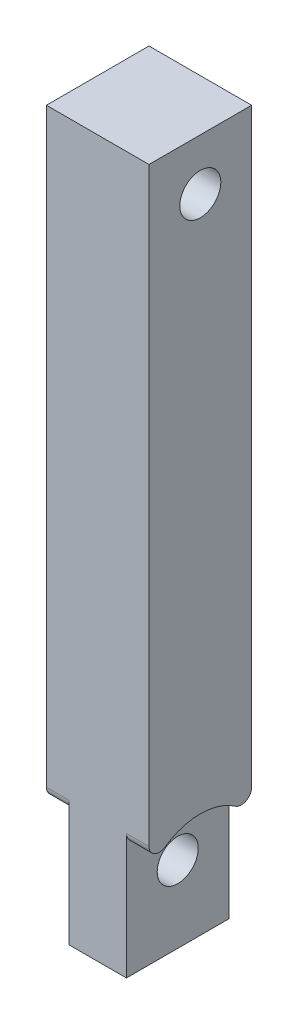
ISO-10303-21;
HEADER;
FILE_DESCRIPTION(('STEP AP214'),'2;1');
FILE_NAME('part.step','',(''),(''),'','','');
FILE_SCHEMA(('AUTOMOTIVE_DESIGN { 1 0 10303 214 1 1 1 1 }'));
ENDSEC;
DATA;
#1=APPLICATION_CONTEXT('core data for automotive mechanical design processes');
#2=APPLICATION_PROTOCOL_DEFINITION('international standard','automotive_design',2000,#1);
#3=PRODUCT_CONTEXT('',#1,'mechanical');
#4=PRODUCT('Part','Part','',(#3));
#5=PRODUCT_RELATED_PRODUCT_CATEGORY('part','',(#4));
#6=PRODUCT_DEFINITION_FORMATION('','',#4);
#7=PRODUCT_DEFINITION_CONTEXT('part definition',#1,'design');
#8=PRODUCT_DEFINITION('design','',#6,#7);
#9=PRODUCT_DEFINITION_SHAPE('','',#8);
#10=(LENGTH_UNIT() NAMED_UNIT(*) SI_UNIT(.MILLI.,.METRE.));
#11=(NAMED_UNIT(*) PLANE_ANGLE_UNIT() SI_UNIT($,.RADIAN.));
#12=(NAMED_UNIT(*) SI_UNIT($,.STERADIAN.) SOLID_ANGLE_UNIT());
#13=UNCERTAINTY_MEASURE_WITH_UNIT(LENGTH_MEASURE(1.E-05),#10,'distance_accuracy_value','');
#14=(GEOMETRIC_REPRESENTATION_CONTEXT(3) GLOBAL_UNCERTAINTY_ASSIGNED_CONTEXT((#13)) GLOBAL_UNIT_ASSIGNED_CONTEXT((#10,
#11,#12)) REPRESENTATION_CONTEXT('',''));
#15=CARTESIAN_POINT('',(0.,0.,0.));
#16=DIRECTION('',(0.,0.,1.));
#17=DIRECTION('',(1.,0.,0.));
#18=AXIS2_PLACEMENT_3D('',#15,#16,#17);
#19=CARTESIAN_POINT('',(0.,300.,0.));
#20=DIRECTION('',(-1.,0.,0.));
#21=DIRECTION('',(0.,0.,1.));
#22=AXIS2_PLACEMENT_3D('',#19,#20,#21);
#23=PLANE('',#22);
#24=CARTESIAN_POINT('',(0.,275.,-25.));
#25=DIRECTION('',(1.,0.,0.));
#26=DIRECTION('',(0.,0.,-1.));
#27=AXIS2_PLACEMENT_3D('',#24,#25,#26);
#28=CIRCLE('',#27,10.);
#29=CARTESIAN_POINT('',(0.,275.,-35.));
#30=VERTEX_POINT('',#29);
#31=EDGE_CURVE('E246',#30,#30,#28,.T.);
#32=ORIENTED_EDGE('',*,*,#31,.F.);
#33=EDGE_LOOP('',(#32));
#34=FACE_BOUND('',#33,.T.);
#35=CARTESIAN_POINT('',(0.,-16.583123951777,-25.));
#36=DIRECTION('',(1.,0.,0.));
#37=DIRECTION('',(0.,0.,-1.));
#38=AXIS2_PLACEMENT_3D('',#35,#36,#37);
#39=CIRCLE('',#38,30.);
#40=CARTESIAN_POINT('',(0.,8.03643024767171,-42.1428571428571));
#41=VERTEX_POINT('',#40);
#42=CARTESIAN_POINT('',(0.,8.0364302476717,-7.85714285714286));
#43=VERTEX_POINT('',#42);
#44=EDGE_CURVE('E143',#41,#43,#39,.T.);
#45=ORIENTED_EDGE('',*,*,#44,.F.);
#46=CARTESIAN_POINT('',(0.,12.1396892809132,-45.));
#47=DIRECTION('',(-1.,0.,0.));
#48=DIRECTION('',(0.,0.,1.));
#49=AXIS2_PLACEMENT_3D('',#46,#47,#48);
#50=CIRCLE('',#49,5.);
#51=CARTESIAN_POINT('',(0.,12.1396892809132,-50.));
#52=VERTEX_POINT('',#51);
#53=EDGE_CURVE('E205',#41,#52,#50,.F.);
#54=ORIENTED_EDGE('',*,*,#53,.T.);
#55=DIRECTION('',(0.,-1.,0.));
#56=VECTOR('',#55,1.);
#57=CARTESIAN_POINT('',(0.,300.,-50.));
#58=LINE('',#57,#56);
#59=CARTESIAN_POINT('',(0.,300.,-50.));
#60=VERTEX_POINT('',#59);
#61=EDGE_CURVE('E170',#60,#52,#58,.T.);
#62=ORIENTED_EDGE('',*,*,#61,.F.);
#63=DIRECTION('',(0.,0.,-1.));
#64=VECTOR('',#63,1.);
#65=CARTESIAN_POINT('',(0.,300.,0.));
#66=LINE('',#65,#64);
#67=CARTESIAN_POINT('',(0.,300.,0.));
#68=VERTEX_POINT('',#67);
#69=EDGE_CURVE('E150',#68,#60,#66,.T.);
#70=ORIENTED_EDGE('',*,*,#69,.F.);
#71=DIRECTION('',(0.,-1.,0.));
#72=VECTOR('',#71,1.);
#73=CARTESIAN_POINT('',(0.,300.,0.));
#74=LINE('',#73,#72);
#75=CARTESIAN_POINT('',(0.,12.1396892809131,0.));
#76=VERTEX_POINT('',#75);
#77=EDGE_CURVE('E163',#68,#76,#74,.T.);
#78=ORIENTED_EDGE('',*,*,#77,.T.);
#79=CARTESIAN_POINT('',(0.,12.1396892809131,-5.));
#80=DIRECTION('',(-1.,0.,0.));
#81=DIRECTION('',(0.,0.,1.));
#82=AXIS2_PLACEMENT_3D('',#79,#80,#81);
#83=CIRCLE('',#82,5.);
#84=EDGE_CURVE('E56',#76,#43,#83,.F.);
#85=ORIENTED_EDGE('',*,*,#84,.T.);
#86=EDGE_LOOP('',(#45,#54,#62,#70,#78,#85));
#87=FACE_BOUND('',#86,.T.);
#88=ADVANCED_FACE('F34',(#34,#87),#23,.F.);
#89=CARTESIAN_POINT('',(0.,300.,-50.));
#90=DIRECTION('',(0.,0.,1.));
#91=DIRECTION('',(1.,0.,0.));
#92=AXIS2_PLACEMENT_3D('',#89,#90,#91);
#93=PLANE('',#92);
#94=ORIENTED_EDGE('',*,*,#61,.T.);
#95=DIRECTION('',(1.,0.,0.));
#96=VECTOR('',#95,1.);
#97=CARTESIAN_POINT('',(0.,12.1396892809132,-50.));
#98=LINE('',#97,#96);
#99=CARTESIAN_POINT('',(-11.,12.1396892809132,-50.));
#100=VERTEX_POINT('',#99);
#101=EDGE_CURVE('E198',#52,#100,#98,.F.);
#102=ORIENTED_EDGE('',*,*,#101,.T.);
#103=DIRECTION('',(0.,1.,0.));
#104=VECTOR('',#103,1.);
#105=CARTESIAN_POINT('',(-11.,-48.9,-50.));
#106=LINE('',#105,#104);
#107=CARTESIAN_POINT('',(-11.,-48.9,-50.));
#108=VERTEX_POINT('',#107);
#109=EDGE_CURVE('E132',#108,#100,#106,.T.);
#110=ORIENTED_EDGE('',*,*,#109,.F.);
#111=DIRECTION('',(1.,0.,0.));
#112=VECTOR('',#111,1.);
#113=CARTESIAN_POINT('',(-39.,-48.9,-50.));
#114=LINE('',#113,#112);
#115=CARTESIAN_POINT('',(-39.,-48.9,-50.));
#116=VERTEX_POINT('',#115);
#117=EDGE_CURVE('E123',#116,#108,#114,.T.);
#118=ORIENTED_EDGE('',*,*,#117,.F.);
#119=DIRECTION('',(0.,1.,0.));
#120=VECTOR('',#119,1.);
#121=CARTESIAN_POINT('',(-39.,-48.9,-50.));
#122=LINE('',#121,#120);
#123=CARTESIAN_POINT('',(-39.,12.1396892809131,-50.));
#124=VERTEX_POINT('',#123);
#125=EDGE_CURVE('E129',#116,#124,#122,.T.);
#126=ORIENTED_EDGE('',*,*,#125,.T.);
#127=DIRECTION('',(1.,0.,0.));
#128=VECTOR('',#127,1.);
#129=CARTESIAN_POINT('',(-50.,12.1396892809131,-50.));
#130=LINE('',#129,#128);
#131=CARTESIAN_POINT('',(-50.,12.1396892809131,-50.));
#132=VERTEX_POINT('',#131);
#133=EDGE_CURVE('E193',#124,#132,#130,.F.);
#134=ORIENTED_EDGE('',*,*,#133,.T.);
#135=DIRECTION('',(0.,-1.,0.));
#136=VECTOR('',#135,1.);
#137=CARTESIAN_POINT('',(-50.,300.,-50.));
#138=LINE('',#137,#136);
#139=CARTESIAN_POINT('',(-50.,300.,-50.));
#140=VERTEX_POINT('',#139);
#141=EDGE_CURVE('E167',#140,#132,#138,.T.);
#142=ORIENTED_EDGE('',*,*,#141,.F.);
#143=DIRECTION('',(-1.,0.,0.));
#144=VECTOR('',#143,1.);
#145=CARTESIAN_POINT('',(0.,300.,-50.));
#146=LINE('',#145,#144);
#147=EDGE_CURVE('E153',#60,#140,#146,.T.);
#148=ORIENTED_EDGE('',*,*,#147,.F.);
#149=EDGE_LOOP('',(#94,#102,#110,#118,#126,#134,#142,#148));
#150=FACE_BOUND('',#149,.T.);
#151=ADVANCED_FACE('F126',(#150),#93,.F.);
#152=CARTESIAN_POINT('',(-50.,300.,0.));
#153=DIRECTION('',(1.,0.,0.));
#154=DIRECTION('',(0.,0.,-1.));
#155=AXIS2_PLACEMENT_3D('',#152,#153,#154);
#156=PLANE('',#155);
#157=CARTESIAN_POINT('',(-50.,275.,-25.));
#158=DIRECTION('',(1.,0.,0.));
#159=DIRECTION('',(0.,0.,-1.));
#160=AXIS2_PLACEMENT_3D('',#157,#158,#159);
#161=CIRCLE('',#160,10.);
#162=CARTESIAN_POINT('',(-50.,275.,-35.));
#163=VERTEX_POINT('',#162);
#164=EDGE_CURVE('E245',#163,#163,#161,.T.);
#165=ORIENTED_EDGE('',*,*,#164,.T.);
#166=EDGE_LOOP('',(#165));
#167=FACE_BOUND('',#166,.T.);
#168=CARTESIAN_POINT('',(-50.,-16.583123951777,-25.));
#169=DIRECTION('',(1.,0.,0.));
#170=DIRECTION('',(0.,0.,-1.));
#171=AXIS2_PLACEMENT_3D('',#168,#169,#170);
#172=CIRCLE('',#171,30.);
#173=CARTESIAN_POINT('',(-50.,8.03643024767169,-42.1428571428572));
#174=VERTEX_POINT('',#173);
#175=CARTESIAN_POINT('',(-50.,8.0364302476717,-7.85714285714286));
#176=VERTEX_POINT('',#175);
#177=EDGE_CURVE('E181',#174,#176,#172,.T.);
#178=ORIENTED_EDGE('',*,*,#177,.T.);
#179=CARTESIAN_POINT('',(-50.,12.1396892809131,-5.));
#180=DIRECTION('',(1.,0.,0.));
#181=DIRECTION('',(0.,0.,-1.));
#182=AXIS2_PLACEMENT_3D('',#179,#180,#181);
#183=CIRCLE('',#182,5.);
#184=CARTESIAN_POINT('',(-50.,12.1396892809131,0.));
#185=VERTEX_POINT('',#184);
#186=EDGE_CURVE('E191',#176,#185,#183,.F.);
#187=ORIENTED_EDGE('',*,*,#186,.T.);
#188=DIRECTION('',(0.,-1.,0.));
#189=VECTOR('',#188,1.);
#190=CARTESIAN_POINT('',(-50.,300.,0.));
#191=LINE('',#190,#189);
#192=CARTESIAN_POINT('',(-50.,300.,0.));
#193=VERTEX_POINT('',#192);
#194=EDGE_CURVE('E164',#193,#185,#191,.T.);
#195=ORIENTED_EDGE('',*,*,#194,.F.);
#196=DIRECTION('',(0.,0.,1.));
#197=VECTOR('',#196,1.);
#198=CARTESIAN_POINT('',(-50.,300.,0.));
#199=LINE('',#198,#197);
#200=EDGE_CURVE('E159',#140,#193,#199,.T.);
#201=ORIENTED_EDGE('',*,*,#200,.F.);
#202=ORIENTED_EDGE('',*,*,#141,.T.);
#203=CARTESIAN_POINT('',(-50.,12.1396892809131,-45.));
#204=DIRECTION('',(1.,0.,0.));
#205=DIRECTION('',(0.,0.,-1.));
#206=AXIS2_PLACEMENT_3D('',#203,#204,#205);
#207=CIRCLE('',#206,5.);
#208=EDGE_CURVE('E189',#132,#174,#207,.F.);
#209=ORIENTED_EDGE('',*,*,#208,.T.);
#210=EDGE_LOOP('',(#178,#187,#195,#201,#202,#209));
#211=FACE_BOUND('',#210,.T.);
#212=ADVANCED_FACE('F252',(#167,#211),#156,.F.);
#213=CARTESIAN_POINT('',(0.,300.,0.));
#214=DIRECTION('',(0.,0.,-1.));
#215=DIRECTION('',(-1.,0.,0.));
#216=AXIS2_PLACEMENT_3D('',#213,#214,#215);
#217=PLANE('',#216);
#218=DIRECTION('',(0.,1.,0.));
#219=VECTOR('',#218,1.);
#220=CARTESIAN_POINT('',(-11.,-48.9,0.));
#221=LINE('',#220,#219);
#222=CARTESIAN_POINT('',(-11.,-48.9,0.));
#223=VERTEX_POINT('',#222);
#224=CARTESIAN_POINT('',(-11.,12.1396892809131,0.));
#225=VERTEX_POINT('',#224);
#226=EDGE_CURVE('E49',#223,#225,#221,.T.);
#227=ORIENTED_EDGE('',*,*,#226,.T.);
#228=DIRECTION('',(1.,0.,0.));
#229=VECTOR('',#228,1.);
#230=CARTESIAN_POINT('',(0.,12.1396892809131,0.));
#231=LINE('',#230,#229);
#232=EDGE_CURVE('E207',#225,#76,#231,.T.);
#233=ORIENTED_EDGE('',*,*,#232,.T.);
#234=ORIENTED_EDGE('',*,*,#77,.F.);
#235=DIRECTION('',(1.,0.,0.));
#236=VECTOR('',#235,1.);
#237=CARTESIAN_POINT('',(0.,300.,0.));
#238=LINE('',#237,#236);
#239=EDGE_CURVE('E161',#193,#68,#238,.T.);
#240=ORIENTED_EDGE('',*,*,#239,.F.);
#241=ORIENTED_EDGE('',*,*,#194,.T.);
#242=DIRECTION('',(1.,0.,0.));
#243=VECTOR('',#242,1.);
#244=CARTESIAN_POINT('',(-39.,12.1396892809131,0.));
#245=LINE('',#244,#243);
#246=CARTESIAN_POINT('',(-39.,12.1396892809131,0.));
#247=VERTEX_POINT('',#246);
#248=EDGE_CURVE('E174',#185,#247,#245,.T.);
#249=ORIENTED_EDGE('',*,*,#248,.T.);
#250=DIRECTION('',(0.,1.,0.));
#251=VECTOR('',#250,1.);
#252=CARTESIAN_POINT('',(-39.,-48.9,0.));
#253=LINE('',#252,#251);
#254=CARTESIAN_POINT('',(-39.,-48.9,0.));
#255=VERTEX_POINT('',#254);
#256=EDGE_CURVE('E234',#255,#247,#253,.T.);
#257=ORIENTED_EDGE('',*,*,#256,.F.);
#258=DIRECTION('',(-1.,0.,0.));
#259=VECTOR('',#258,1.);
#260=CARTESIAN_POINT('',(-39.,-48.9,0.));
#261=LINE('',#260,#259);
#262=EDGE_CURVE('E140',#223,#255,#261,.T.);
#263=ORIENTED_EDGE('',*,*,#262,.F.);
#264=EDGE_LOOP('',(#227,#233,#234,#240,#241,#249,#257,#263));
#265=FACE_BOUND('',#264,.T.);
#266=ADVANCED_FACE('F233',(#265),#217,.F.);
#267=CARTESIAN_POINT('',(0.,300.,0.));
#268=DIRECTION('',(0.,1.,0.));
#269=DIRECTION('',(0.,0.,1.));
#270=AXIS2_PLACEMENT_3D('',#267,#268,#269);
#271=PLANE('',#270);
#272=ORIENTED_EDGE('',*,*,#69,.T.);
#273=ORIENTED_EDGE('',*,*,#147,.T.);
#274=ORIENTED_EDGE('',*,*,#200,.T.);
#275=ORIENTED_EDGE('',*,*,#239,.T.);
#276=EDGE_LOOP('',(#272,#273,#274,#275));
#277=FACE_BOUND('',#276,.T.);
#278=ADVANCED_FACE('F230',(#277),#271,.T.);
#279=CARTESIAN_POINT('',(-39.,-48.9,0.));
#280=DIRECTION('',(1.,0.,0.));
#281=DIRECTION('',(0.,0.,-1.));
#282=AXIS2_PLACEMENT_3D('',#279,#280,#281);
#283=PLANE('',#282);
#284=CARTESIAN_POINT('',(-39.,-11.583123951777,-25.));
#285=DIRECTION('',(-1.,0.,0.));
#286=DIRECTION('',(0.,0.,1.));
#287=AXIS2_PLACEMENT_3D('',#284,#285,#286);
#288=CIRCLE('',#287,10.);
#289=CARTESIAN_POINT('',(-39.,-11.583123951777,-15.));
#290=VERTEX_POINT('',#289);
#291=EDGE_CURVE('E182',#290,#290,#288,.T.);
#292=ORIENTED_EDGE('',*,*,#291,.F.);
#293=EDGE_LOOP('',(#292));
#294=FACE_BOUND('',#293,.T.);
#295=ORIENTED_EDGE('',*,*,#256,.T.);
#296=CARTESIAN_POINT('',(-39.,12.1396892809131,-5.));
#297=DIRECTION('',(1.,0.,0.));
#298=DIRECTION('',(0.,0.,-1.));
#299=AXIS2_PLACEMENT_3D('',#296,#297,#298);
#300=CIRCLE('',#299,5.);
#301=CARTESIAN_POINT('',(-39.,8.0364302476717,-7.85714285714286));
#302=VERTEX_POINT('',#301);
#303=EDGE_CURVE('E195',#247,#302,#300,.T.);
#304=ORIENTED_EDGE('',*,*,#303,.T.);
#305=CARTESIAN_POINT('',(-39.,-16.583123951777,-25.));
#306=DIRECTION('',(1.,0.,0.));
#307=DIRECTION('',(0.,0.,-1.));
#308=AXIS2_PLACEMENT_3D('',#305,#306,#307);
#309=CIRCLE('',#308,30.);
#310=CARTESIAN_POINT('',(-39.,8.03643024767169,-42.1428571428572));
#311=VERTEX_POINT('',#310);
#312=EDGE_CURVE('E220',#311,#302,#309,.T.);
#313=ORIENTED_EDGE('',*,*,#312,.F.);
#314=CARTESIAN_POINT('',(-39.,12.1396892809131,-45.));
#315=DIRECTION('',(1.,0.,0.));
#316=DIRECTION('',(0.,0.,-1.));
#317=AXIS2_PLACEMENT_3D('',#314,#315,#316);
#318=CIRCLE('',#317,5.);
#319=EDGE_CURVE('E148',#311,#124,#318,.T.);
#320=ORIENTED_EDGE('',*,*,#319,.T.);
#321=ORIENTED_EDGE('',*,*,#125,.F.);
#322=DIRECTION('',(0.,0.,-1.));
#323=VECTOR('',#322,1.);
#324=CARTESIAN_POINT('',(-39.,-48.9,0.));
#325=LINE('',#324,#323);
#326=EDGE_CURVE('E136',#255,#116,#325,.T.);
#327=ORIENTED_EDGE('',*,*,#326,.F.);
#328=EDGE_LOOP('',(#295,#304,#313,#320,#321,#327));
#329=FACE_BOUND('',#328,.T.);
#330=ADVANCED_FACE('F145',(#294,#329),#283,.F.);
#331=CARTESIAN_POINT('',(-11.,-48.9,0.));
#332=DIRECTION('',(-1.,0.,0.));
#333=DIRECTION('',(0.,0.,1.));
#334=AXIS2_PLACEMENT_3D('',#331,#332,#333);
#335=PLANE('',#334);
#336=CARTESIAN_POINT('',(-11.,-11.583123951777,-25.));
#337=DIRECTION('',(-1.,0.,0.));
#338=DIRECTION('',(0.,0.,1.));
#339=AXIS2_PLACEMENT_3D('',#336,#337,#338);
#340=CIRCLE('',#339,10.);
#341=CARTESIAN_POINT('',(-11.,-11.583123951777,-15.));
#342=VERTEX_POINT('',#341);
#343=EDGE_CURVE('E178',#342,#342,#340,.T.);
#344=ORIENTED_EDGE('',*,*,#343,.T.);
#345=EDGE_LOOP('',(#344));
#346=FACE_BOUND('',#345,.T.);
#347=ORIENTED_EDGE('',*,*,#109,.T.);
#348=CARTESIAN_POINT('',(-11.,12.1396892809132,-45.));
#349=DIRECTION('',(-1.,0.,0.));
#350=DIRECTION('',(0.,0.,1.));
#351=AXIS2_PLACEMENT_3D('',#348,#349,#350);
#352=CIRCLE('',#351,5.);
#353=CARTESIAN_POINT('',(-11.,8.03643024767171,-42.1428571428571));
#354=VERTEX_POINT('',#353);
#355=EDGE_CURVE('E42',#100,#354,#352,.T.);
#356=ORIENTED_EDGE('',*,*,#355,.T.);
#357=CARTESIAN_POINT('',(-11.,-16.583123951777,-25.));
#358=DIRECTION('',(-1.,0.,0.));
#359=DIRECTION('',(0.,0.,1.));
#360=AXIS2_PLACEMENT_3D('',#357,#358,#359);
#361=CIRCLE('',#360,30.);
#362=CARTESIAN_POINT('',(-11.,8.0364302476717,-7.85714285714286));
#363=VERTEX_POINT('',#362);
#364=EDGE_CURVE('E177',#354,#363,#361,.F.);
#365=ORIENTED_EDGE('',*,*,#364,.T.);
#366=CARTESIAN_POINT('',(-11.,12.1396892809131,-5.));
#367=DIRECTION('',(-1.,0.,0.));
#368=DIRECTION('',(0.,0.,1.));
#369=AXIS2_PLACEMENT_3D('',#366,#367,#368);
#370=CIRCLE('',#369,5.);
#371=EDGE_CURVE('E11',#363,#225,#370,.T.);
#372=ORIENTED_EDGE('',*,*,#371,.T.);
#373=ORIENTED_EDGE('',*,*,#226,.F.);
#374=DIRECTION('',(0.,0.,1.));
#375=VECTOR('',#374,1.);
#376=CARTESIAN_POINT('',(-11.,-48.9,0.));
#377=LINE('',#376,#375);
#378=EDGE_CURVE('E135',#108,#223,#377,.T.);
#379=ORIENTED_EDGE('',*,*,#378,.F.);
#380=EDGE_LOOP('',(#347,#356,#365,#372,#373,#379));
#381=FACE_BOUND('',#380,.T.);
#382=ADVANCED_FACE('F212',(#346,#381),#335,.F.);
#383=CARTESIAN_POINT('',(0.,-48.9,0.));
#384=DIRECTION('',(0.,-1.,0.));
#385=DIRECTION('',(0.,0.,-1.));
#386=AXIS2_PLACEMENT_3D('',#383,#384,#385);
#387=PLANE('',#386);
#388=ORIENTED_EDGE('',*,*,#326,.T.);
#389=ORIENTED_EDGE('',*,*,#117,.T.);
#390=ORIENTED_EDGE('',*,*,#378,.T.);
#391=ORIENTED_EDGE('',*,*,#262,.T.);
#392=EDGE_LOOP('',(#388,#389,#390,#391));
#393=FACE_BOUND('',#392,.T.);
#394=ADVANCED_FACE('F139',(#393),#387,.T.);
#395=CARTESIAN_POINT('',(-62.7688377587655,-16.583123951777,-25.));
#396=DIRECTION('',(1.,0.,0.));
#397=DIRECTION('',(0.,0.,-1.));
#398=AXIS2_PLACEMENT_3D('',#395,#396,#397);
#399=CYLINDRICAL_SURFACE('',#398,30.);
#400=ORIENTED_EDGE('',*,*,#364,.F.);
#401=DIRECTION('',(1.,0.,0.));
#402=VECTOR('',#401,1.);
#403=CARTESIAN_POINT('',(-62.7688377587655,8.03643024767171,-42.1428571428571));
#404=LINE('',#403,#402);
#405=EDGE_CURVE('E202',#354,#41,#404,.T.);
#406=ORIENTED_EDGE('',*,*,#405,.T.);
#407=ORIENTED_EDGE('',*,*,#44,.T.);
#408=DIRECTION('',(1.,0.,0.));
#409=VECTOR('',#408,1.);
#410=CARTESIAN_POINT('',(-62.7688377587655,8.0364302476717,-7.85714285714286));
#411=LINE('',#410,#409);
#412=EDGE_CURVE('E200',#43,#363,#411,.F.);
#413=ORIENTED_EDGE('',*,*,#412,.T.);
#414=EDGE_LOOP('',(#400,#406,#407,#413));
#415=FACE_BOUND('',#414,.T.);
#416=ADVANCED_FACE('F218',(#415),#399,.F.);
#417=CARTESIAN_POINT('',(12.7688377587655,-16.583123951777,-25.));
#418=DIRECTION('',(-1.,0.,0.));
#419=DIRECTION('',(0.,0.,1.));
#420=AXIS2_PLACEMENT_3D('',#417,#418,#419);
#421=CYLINDRICAL_SURFACE('',#420,30.);
#422=ORIENTED_EDGE('',*,*,#312,.T.);
#423=DIRECTION('',(-1.,0.,0.));
#424=VECTOR('',#423,1.);
#425=CARTESIAN_POINT('',(12.7688377587655,8.0364302476717,-7.85714285714286));
#426=LINE('',#425,#424);
#427=EDGE_CURVE('E187',#302,#176,#426,.T.);
#428=ORIENTED_EDGE('',*,*,#427,.T.);
#429=ORIENTED_EDGE('',*,*,#177,.F.);
#430=DIRECTION('',(-1.,0.,0.));
#431=VECTOR('',#430,1.);
#432=CARTESIAN_POINT('',(12.7688377587655,8.03643024767169,-42.1428571428572));
#433=LINE('',#432,#431);
#434=EDGE_CURVE('E185',#174,#311,#433,.F.);
#435=ORIENTED_EDGE('',*,*,#434,.T.);
#436=EDGE_LOOP('',(#422,#428,#429,#435));
#437=FACE_BOUND('',#436,.T.);
#438=ADVANCED_FACE('F363',(#437),#421,.F.);
#439=CARTESIAN_POINT('',(0.,-11.583123951777,-25.));
#440=DIRECTION('',(-1.,0.,0.));
#441=DIRECTION('',(0.,0.,1.));
#442=AXIS2_PLACEMENT_3D('',#439,#440,#441);
#443=CYLINDRICAL_SURFACE('',#442,10.);
#444=ORIENTED_EDGE('',*,*,#291,.T.);
#445=EDGE_LOOP('',(#444));
#446=FACE_BOUND('',#445,.T.);
#447=ORIENTED_EDGE('',*,*,#343,.F.);
#448=EDGE_LOOP('',(#447));
#449=FACE_BOUND('',#448,.T.);
#450=ADVANCED_FACE('F273',(#446,#449),#443,.F.);
#451=CARTESIAN_POINT('',(12.7688377587655,12.1396892809131,-5.));
#452=DIRECTION('',(-1.,0.,0.));
#453=DIRECTION('',(0.,0.,1.));
#454=AXIS2_PLACEMENT_3D('',#451,#452,#453);
#455=CYLINDRICAL_SURFACE('',#454,5.);
#456=ORIENTED_EDGE('',*,*,#186,.F.);
#457=ORIENTED_EDGE('',*,*,#427,.F.);
#458=ORIENTED_EDGE('',*,*,#303,.F.);
#459=ORIENTED_EDGE('',*,*,#248,.F.);
#460=EDGE_LOOP('',(#456,#457,#458,#459));
#461=FACE_BOUND('',#460,.T.);
#462=ADVANCED_FACE('F269',(#461),#455,.T.);
#463=CARTESIAN_POINT('',(12.7688377587655,12.1396892809131,-45.));
#464=DIRECTION('',(-1.,0.,0.));
#465=DIRECTION('',(0.,0.,1.));
#466=AXIS2_PLACEMENT_3D('',#463,#464,#465);
#467=CYLINDRICAL_SURFACE('',#466,5.);
#468=ORIENTED_EDGE('',*,*,#319,.F.);
#469=ORIENTED_EDGE('',*,*,#434,.F.);
#470=ORIENTED_EDGE('',*,*,#208,.F.);
#471=ORIENTED_EDGE('',*,*,#133,.F.);
#472=EDGE_LOOP('',(#468,#469,#470,#471));
#473=FACE_BOUND('',#472,.T.);
#474=ADVANCED_FACE('F272',(#473),#467,.T.);
#475=CARTESIAN_POINT('',(-62.7688377587655,12.1396892809132,-45.));
#476=DIRECTION('',(1.,0.,0.));
#477=DIRECTION('',(0.,0.,-1.));
#478=AXIS2_PLACEMENT_3D('',#475,#476,#477);
#479=CYLINDRICAL_SURFACE('',#478,5.);
#480=ORIENTED_EDGE('',*,*,#53,.F.);
#481=ORIENTED_EDGE('',*,*,#405,.F.);
#482=ORIENTED_EDGE('',*,*,#355,.F.);
#483=ORIENTED_EDGE('',*,*,#101,.F.);
#484=EDGE_LOOP('',(#480,#481,#482,#483));
#485=FACE_BOUND('',#484,.T.);
#486=ADVANCED_FACE('F223',(#485),#479,.T.);
#487=CARTESIAN_POINT('',(-62.7688377587655,12.1396892809131,-5.));
#488=DIRECTION('',(1.,0.,0.));
#489=DIRECTION('',(0.,0.,-1.));
#490=AXIS2_PLACEMENT_3D('',#487,#488,#489);
#491=CYLINDRICAL_SURFACE('',#490,5.);
#492=ORIENTED_EDGE('',*,*,#371,.F.);
#493=ORIENTED_EDGE('',*,*,#412,.F.);
#494=ORIENTED_EDGE('',*,*,#84,.F.);
#495=ORIENTED_EDGE('',*,*,#232,.F.);
#496=EDGE_LOOP('',(#492,#493,#494,#495));
#497=FACE_BOUND('',#496,.T.);
#498=ADVANCED_FACE('F36',(#497),#491,.T.);
#499=CARTESIAN_POINT('',(-50.,275.,-25.));
#500=DIRECTION('',(1.,0.,0.));
#501=DIRECTION('',(0.,0.,-1.));
#502=AXIS2_PLACEMENT_3D('',#499,#500,#501);
#503=CYLINDRICAL_SURFACE('',#502,10.);
#504=ORIENTED_EDGE('',*,*,#164,.F.);
#505=EDGE_LOOP('',(#504));
#506=FACE_BOUND('',#505,.T.);
#507=ORIENTED_EDGE('',*,*,#31,.T.);
#508=EDGE_LOOP('',(#507));
#509=FACE_BOUND('',#508,.T.);
#510=ADVANCED_FACE('F255',(#506,#509),#503,.F.);
#511=CLOSED_SHELL('',(#88,#151,#212,#266,#278,#330,#382,#394,#416,#438,#450,#462,#474,#486,#498,#510));
#512=MANIFOLD_SOLID_BREP('B2',#511);
#513=ADVANCED_BREP_SHAPE_REPRESENTATION('',(#18,#512),#14);
#514=SHAPE_DEFINITION_REPRESENTATION(#9,#513);
ENDSEC;
END-ISO-10303-21;
